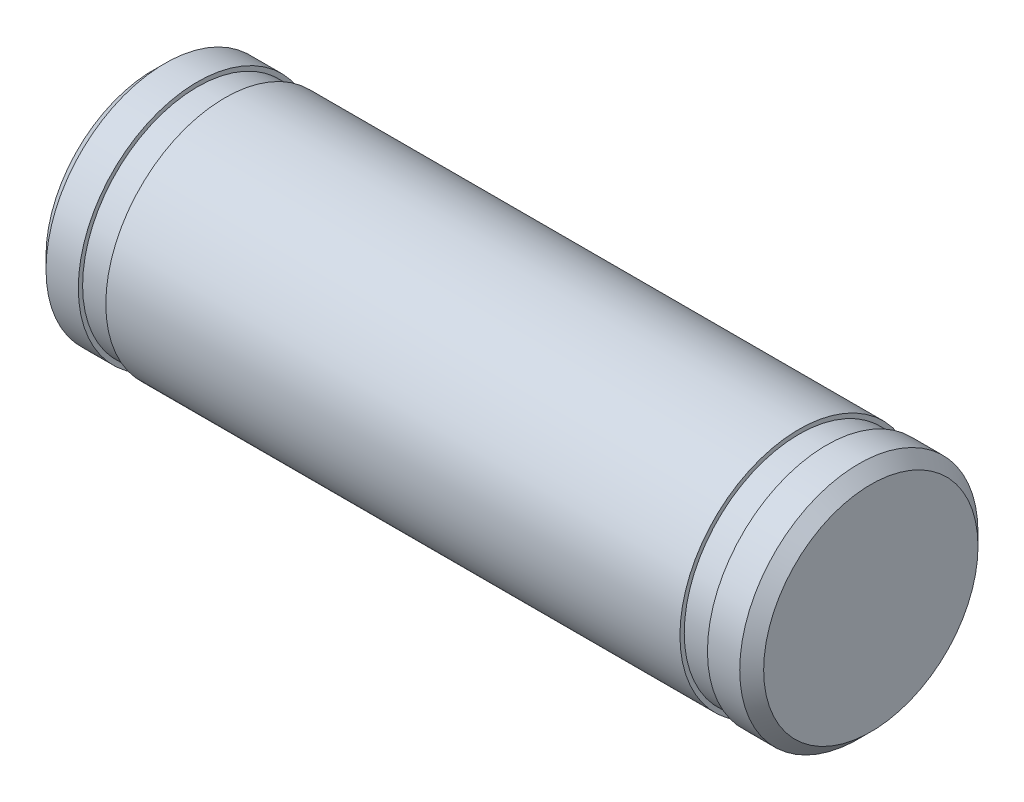
ISO-10303-21;
HEADER;
FILE_DESCRIPTION(('STEP AP214'),'2;1');
FILE_NAME('part.step','',(''),(''),'','','');
FILE_SCHEMA(('AUTOMOTIVE_DESIGN { 1 0 10303 214 1 1 1 1 }'));
ENDSEC;
DATA;
#1=APPLICATION_CONTEXT('core data for automotive mechanical design processes');
#2=APPLICATION_PROTOCOL_DEFINITION('international standard','automotive_design',2000,#1);
#3=PRODUCT_CONTEXT('',#1,'mechanical');
#4=PRODUCT('Part','Part','',(#3));
#5=PRODUCT_RELATED_PRODUCT_CATEGORY('part','',(#4));
#6=PRODUCT_DEFINITION_FORMATION('','',#4);
#7=PRODUCT_DEFINITION_CONTEXT('part definition',#1,'design');
#8=PRODUCT_DEFINITION('design','',#6,#7);
#9=PRODUCT_DEFINITION_SHAPE('','',#8);
#10=(LENGTH_UNIT() NAMED_UNIT(*) SI_UNIT(.MILLI.,.METRE.));
#11=(NAMED_UNIT(*) PLANE_ANGLE_UNIT() SI_UNIT($,.RADIAN.));
#12=(NAMED_UNIT(*) SI_UNIT($,.STERADIAN.) SOLID_ANGLE_UNIT());
#13=UNCERTAINTY_MEASURE_WITH_UNIT(LENGTH_MEASURE(1.E-05),#10,'distance_accuracy_value','');
#14=(GEOMETRIC_REPRESENTATION_CONTEXT(3) GLOBAL_UNCERTAINTY_ASSIGNED_CONTEXT((#13)) GLOBAL_UNIT_ASSIGNED_CONTEXT((#10,
#11,#12)) REPRESENTATION_CONTEXT('',''));
#15=CARTESIAN_POINT('',(0.,0.,0.));
#16=DIRECTION('',(0.,0.,1.));
#17=DIRECTION('',(1.,0.,0.));
#18=AXIS2_PLACEMENT_3D('',#15,#16,#17);
#19=CARTESIAN_POINT('',(15.,0.,0.));
#20=DIRECTION('',(-1.,0.,0.));
#21=DIRECTION('',(0.,0.,1.));
#22=AXIS2_PLACEMENT_3D('',#19,#20,#21);
#23=CYLINDRICAL_SURFACE('',#22,4.98);
#24=CARTESIAN_POINT('',(-12.,0.,0.));
#25=DIRECTION('',(-1.,0.,0.));
#26=DIRECTION('',(0.,0.,1.));
#27=AXIS2_PLACEMENT_3D('',#24,#25,#26);
#28=CIRCLE('',#27,4.98);
#29=CARTESIAN_POINT('',(-12.,0.,4.98));
#30=VERTEX_POINT('',#29);
#31=EDGE_CURVE('E67',#30,#30,#28,.T.);
#32=ORIENTED_EDGE('',*,*,#31,.F.);
#33=EDGE_LOOP('',(#32));
#34=FACE_BOUND('',#33,.T.);
#35=CARTESIAN_POINT('',(12.,0.,0.));
#36=DIRECTION('',(-1.,0.,0.));
#37=DIRECTION('',(0.,0.,1.));
#38=AXIS2_PLACEMENT_3D('',#35,#36,#37);
#39=CIRCLE('',#38,4.98);
#40=CARTESIAN_POINT('',(12.,0.,4.98));
#41=VERTEX_POINT('',#40);
#42=EDGE_CURVE('E80',#41,#41,#39,.T.);
#43=ORIENTED_EDGE('',*,*,#42,.T.);
#44=EDGE_LOOP('',(#43));
#45=FACE_BOUND('',#44,.T.);
#46=ADVANCED_FACE('F40',(#34,#45),#23,.T.);
#47=CARTESIAN_POINT('',(-12.,0.,0.));
#48=DIRECTION('',(-1.,0.,0.));
#49=DIRECTION('',(0.,0.,1.));
#50=AXIS2_PLACEMENT_3D('',#47,#48,#49);
#51=PLANE('',#50);
#52=CARTESIAN_POINT('',(-12.,0.,0.));
#53=DIRECTION('',(-1.,0.,0.));
#54=DIRECTION('',(0.,0.,1.));
#55=AXIS2_PLACEMENT_3D('',#52,#53,#54);
#56=CIRCLE('',#55,4.8);
#57=CARTESIAN_POINT('',(-12.,0.,4.8));
#58=VERTEX_POINT('',#57);
#59=EDGE_CURVE('E72',#58,#58,#56,.T.);
#60=ORIENTED_EDGE('',*,*,#59,.F.);
#61=EDGE_LOOP('',(#60));
#62=FACE_BOUND('',#61,.T.);
#63=ORIENTED_EDGE('',*,*,#31,.T.);
#64=EDGE_LOOP('',(#63));
#65=FACE_BOUND('',#64,.T.);
#66=ADVANCED_FACE('F122',(#62,#65),#51,.T.);
#67=CARTESIAN_POINT('',(-13.15,0.,0.));
#68=DIRECTION('',(-1.,0.,0.));
#69=DIRECTION('',(0.,0.,1.));
#70=AXIS2_PLACEMENT_3D('',#67,#68,#69);
#71=PLANE('',#70);
#72=CARTESIAN_POINT('',(-13.15,0.,0.));
#73=DIRECTION('',(-1.,0.,0.));
#74=DIRECTION('',(0.,0.,1.));
#75=AXIS2_PLACEMENT_3D('',#72,#73,#74);
#76=CIRCLE('',#75,4.8);
#77=CARTESIAN_POINT('',(-13.15,0.,4.8));
#78=VERTEX_POINT('',#77);
#79=EDGE_CURVE('E76',#78,#78,#76,.T.);
#80=ORIENTED_EDGE('',*,*,#79,.T.);
#81=EDGE_LOOP('',(#80));
#82=FACE_BOUND('',#81,.T.);
#83=CARTESIAN_POINT('',(-13.15,0.,0.));
#84=DIRECTION('',(-1.,0.,0.));
#85=DIRECTION('',(0.,0.,1.));
#86=AXIS2_PLACEMENT_3D('',#83,#84,#85);
#87=CIRCLE('',#86,4.98);
#88=CARTESIAN_POINT('',(-13.15,0.,4.98));
#89=VERTEX_POINT('',#88);
#90=EDGE_CURVE('E68',#89,#89,#87,.T.);
#91=ORIENTED_EDGE('',*,*,#90,.F.);
#92=EDGE_LOOP('',(#91));
#93=FACE_BOUND('',#92,.T.);
#94=ADVANCED_FACE('F130',(#82,#93),#71,.F.);
#95=CARTESIAN_POINT('',(-12.,0.,0.));
#96=DIRECTION('',(-1.,0.,0.));
#97=DIRECTION('',(0.,0.,1.));
#98=AXIS2_PLACEMENT_3D('',#95,#96,#97);
#99=CYLINDRICAL_SURFACE('',#98,4.8);
#100=ORIENTED_EDGE('',*,*,#59,.T.);
#101=EDGE_LOOP('',(#100));
#102=FACE_BOUND('',#101,.T.);
#103=ORIENTED_EDGE('',*,*,#79,.F.);
#104=EDGE_LOOP('',(#103));
#105=FACE_BOUND('',#104,.T.);
#106=ADVANCED_FACE('F145',(#102,#105),#99,.T.);
#107=CARTESIAN_POINT('',(-15.,0.,0.));
#108=DIRECTION('',(1.,0.,0.));
#109=DIRECTION('',(0.,0.,-1.));
#110=AXIS2_PLACEMENT_3D('',#107,#108,#109);
#111=PLANE('',#110);
#112=CARTESIAN_POINT('',(-15.,0.,0.));
#113=DIRECTION('',(1.,0.,0.));
#114=DIRECTION('',(0.,0.,-1.));
#115=AXIS2_PLACEMENT_3D('',#112,#113,#114);
#116=CIRCLE('',#115,4.47999999999999);
#117=CARTESIAN_POINT('',(-15.,0.,-4.47999999999999));
#118=VERTEX_POINT('',#117);
#119=EDGE_CURVE('E55',#118,#118,#116,.F.);
#120=ORIENTED_EDGE('',*,*,#119,.T.);
#121=EDGE_LOOP('',(#120));
#122=FACE_BOUND('',#121,.T.);
#123=ADVANCED_FACE('F138',(#122),#111,.F.);
#124=CARTESIAN_POINT('',(-14.5,0.,0.));
#125=DIRECTION('',(1.,0.,0.));
#126=DIRECTION('',(0.,0.,-1.));
#127=AXIS2_PLACEMENT_3D('',#124,#125,#126);
#128=CIRCLE('',#127,4.98);
#129=CARTESIAN_POINT('',(-14.5,0.,-4.98));
#130=VERTEX_POINT('',#129);
#131=EDGE_CURVE('E61',#130,#130,#128,.T.);
#132=ORIENTED_EDGE('',*,*,#131,.T.);
#133=EDGE_LOOP('',(#132));
#134=FACE_BOUND('',#133,.T.);
#135=ORIENTED_EDGE('',*,*,#90,.T.);
#136=EDGE_LOOP('',(#135));
#137=FACE_BOUND('',#136,.T.);
#138=ADVANCED_FACE('F126',(#134,#137),#23,.T.);
#139=CARTESIAN_POINT('',(-14.5,0.,0.));
#140=DIRECTION('',(1.,0.,0.));
#141=DIRECTION('',(0.,0.,-1.));
#142=AXIS2_PLACEMENT_3D('',#139,#140,#141);
#143=CONICAL_SURFACE('',#142,4.98,0.785398163397447);
#144=ORIENTED_EDGE('',*,*,#119,.F.);
#145=EDGE_LOOP('',(#144));
#146=FACE_BOUND('',#145,.T.);
#147=ORIENTED_EDGE('',*,*,#131,.F.);
#148=EDGE_LOOP('',(#147));
#149=FACE_BOUND('',#148,.T.);
#150=ADVANCED_FACE('F117',(#146,#149),#143,.T.);
#151=CARTESIAN_POINT('',(12.,0.,0.));
#152=DIRECTION('',(1.,0.,0.));
#153=DIRECTION('',(0.,0.,1.));
#154=AXIS2_PLACEMENT_3D('',#151,#152,#153);
#155=PLANE('',#154);
#156=ORIENTED_EDGE('',*,*,#42,.F.);
#157=EDGE_LOOP('',(#156));
#158=FACE_BOUND('',#157,.T.);
#159=CARTESIAN_POINT('',(12.,0.,0.));
#160=DIRECTION('',(-1.,0.,0.));
#161=DIRECTION('',(0.,0.,1.));
#162=AXIS2_PLACEMENT_3D('',#159,#160,#161);
#163=CIRCLE('',#162,4.8);
#164=CARTESIAN_POINT('',(12.,0.,4.8));
#165=VERTEX_POINT('',#164);
#166=EDGE_CURVE('E88',#165,#165,#163,.T.);
#167=ORIENTED_EDGE('',*,*,#166,.T.);
#168=EDGE_LOOP('',(#167));
#169=FACE_BOUND('',#168,.T.);
#170=ADVANCED_FACE('F101',(#158,#169),#155,.T.);
#171=CARTESIAN_POINT('',(13.15,0.,0.));
#172=DIRECTION('',(1.,0.,0.));
#173=DIRECTION('',(0.,0.,1.));
#174=AXIS2_PLACEMENT_3D('',#171,#172,#173);
#175=PLANE('',#174);
#176=CARTESIAN_POINT('',(13.15,0.,0.));
#177=DIRECTION('',(-1.,0.,0.));
#178=DIRECTION('',(0.,0.,1.));
#179=AXIS2_PLACEMENT_3D('',#176,#177,#178);
#180=CIRCLE('',#179,4.98);
#181=CARTESIAN_POINT('',(13.15,0.,4.98));
#182=VERTEX_POINT('',#181);
#183=EDGE_CURVE('E84',#182,#182,#180,.T.);
#184=ORIENTED_EDGE('',*,*,#183,.T.);
#185=EDGE_LOOP('',(#184));
#186=FACE_BOUND('',#185,.T.);
#187=CARTESIAN_POINT('',(13.15,0.,0.));
#188=DIRECTION('',(-1.,0.,0.));
#189=DIRECTION('',(0.,0.,1.));
#190=AXIS2_PLACEMENT_3D('',#187,#188,#189);
#191=CIRCLE('',#190,4.8);
#192=CARTESIAN_POINT('',(13.15,0.,4.8));
#193=VERTEX_POINT('',#192);
#194=EDGE_CURVE('E92',#193,#193,#191,.T.);
#195=ORIENTED_EDGE('',*,*,#194,.F.);
#196=EDGE_LOOP('',(#195));
#197=FACE_BOUND('',#196,.T.);
#198=ADVANCED_FACE('F107',(#186,#197),#175,.F.);
#199=CARTESIAN_POINT('',(12.,0.,0.));
#200=DIRECTION('',(1.,0.,0.));
#201=DIRECTION('',(0.,0.,-1.));
#202=AXIS2_PLACEMENT_3D('',#199,#200,#201);
#203=CYLINDRICAL_SURFACE('',#202,4.8);
#204=ORIENTED_EDGE('',*,*,#166,.F.);
#205=EDGE_LOOP('',(#204));
#206=FACE_BOUND('',#205,.T.);
#207=ORIENTED_EDGE('',*,*,#194,.T.);
#208=EDGE_LOOP('',(#207));
#209=FACE_BOUND('',#208,.T.);
#210=ADVANCED_FACE('F103',(#206,#209),#203,.T.);
#211=CARTESIAN_POINT('',(15.,0.,0.));
#212=DIRECTION('',(1.,0.,0.));
#213=DIRECTION('',(0.,0.,-1.));
#214=AXIS2_PLACEMENT_3D('',#211,#212,#213);
#215=PLANE('',#214);
#216=CARTESIAN_POINT('',(15.,0.,0.));
#217=DIRECTION('',(1.,0.,0.));
#218=DIRECTION('',(0.,0.,-1.));
#219=AXIS2_PLACEMENT_3D('',#216,#217,#218);
#220=CIRCLE('',#219,4.48);
#221=CARTESIAN_POINT('',(15.,0.,-4.48));
#222=VERTEX_POINT('',#221);
#223=EDGE_CURVE('E49',#222,#222,#220,.T.);
#224=ORIENTED_EDGE('',*,*,#223,.T.);
#225=EDGE_LOOP('',(#224));
#226=FACE_BOUND('',#225,.T.);
#227=ADVANCED_FACE('F106',(#226),#215,.T.);
#228=CARTESIAN_POINT('',(14.5,0.,0.));
#229=DIRECTION('',(1.,0.,0.));
#230=DIRECTION('',(0.,0.,-1.));
#231=AXIS2_PLACEMENT_3D('',#228,#229,#230);
#232=CIRCLE('',#231,4.98);
#233=CARTESIAN_POINT('',(14.5,0.,-4.98));
#234=VERTEX_POINT('',#233);
#235=EDGE_CURVE('E10',#234,#234,#232,.F.);
#236=ORIENTED_EDGE('',*,*,#235,.T.);
#237=EDGE_LOOP('',(#236));
#238=FACE_BOUND('',#237,.T.);
#239=ORIENTED_EDGE('',*,*,#183,.F.);
#240=EDGE_LOOP('',(#239));
#241=FACE_BOUND('',#240,.T.);
#242=ADVANCED_FACE('F125',(#238,#241),#23,.T.);
#243=CARTESIAN_POINT('',(15.,0.,0.));
#244=DIRECTION('',(-1.,0.,0.));
#245=DIRECTION('',(0.,0.,1.));
#246=AXIS2_PLACEMENT_3D('',#243,#244,#245);
#247=CONICAL_SURFACE('',#246,4.48,0.785398163397453);
#248=ORIENTED_EDGE('',*,*,#235,.F.);
#249=EDGE_LOOP('',(#248));
#250=FACE_BOUND('',#249,.T.);
#251=ORIENTED_EDGE('',*,*,#223,.F.);
#252=EDGE_LOOP('',(#251));
#253=FACE_BOUND('',#252,.T.);
#254=ADVANCED_FACE('F43',(#250,#253),#247,.T.);
#255=CLOSED_SHELL('',(#46,#66,#94,#106,#123,#138,#150,#170,#198,#210,#227,#242,#254));
#256=MANIFOLD_SOLID_BREP('B2',#255);
#257=ADVANCED_BREP_SHAPE_REPRESENTATION('',(#18,#256),#14);
#258=SHAPE_DEFINITION_REPRESENTATION(#9,#257);
ENDSEC;
END-ISO-10303-21;
